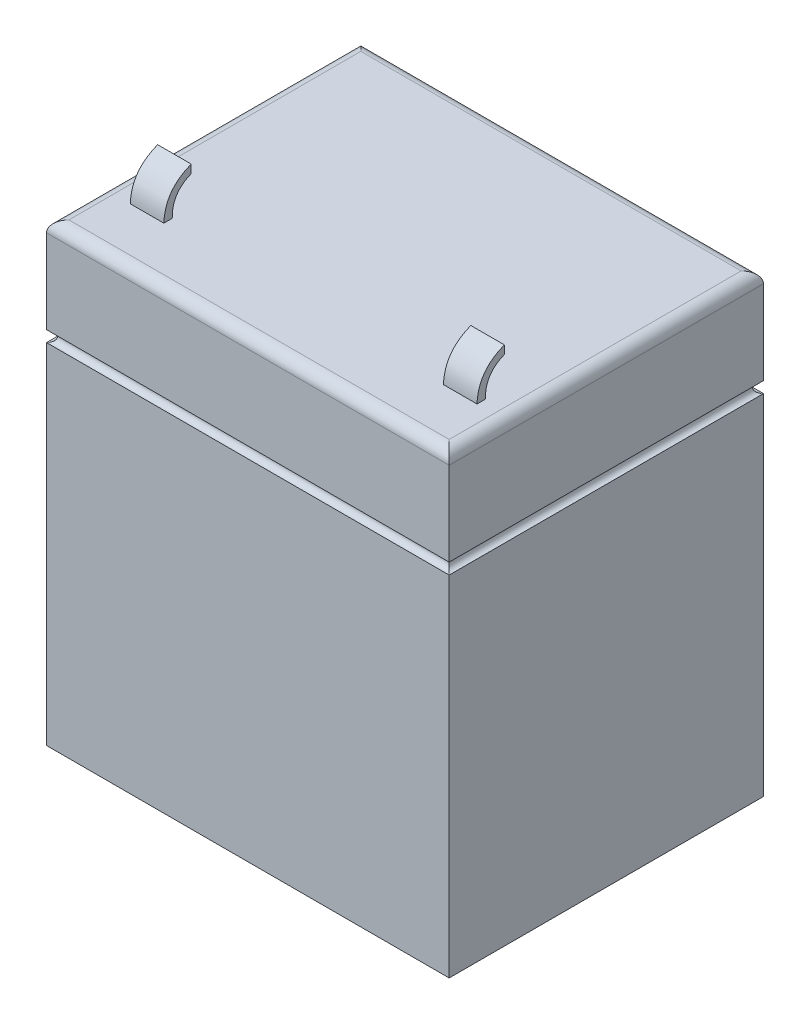
ISO-10303-21;
HEADER;
FILE_DESCRIPTION(('STEP AP214'),'2;1');
FILE_NAME('part.step','',(''),(''),'','','');
FILE_SCHEMA(('AUTOMOTIVE_DESIGN { 1 0 10303 214 1 1 1 1 }'));
ENDSEC;
DATA;
#1=APPLICATION_CONTEXT('core data for automotive mechanical design processes');
#2=APPLICATION_PROTOCOL_DEFINITION('international standard','automotive_design',2000,#1);
#3=PRODUCT_CONTEXT('',#1,'mechanical');
#4=PRODUCT('Part','Part','',(#3));
#5=PRODUCT_RELATED_PRODUCT_CATEGORY('part','',(#4));
#6=PRODUCT_DEFINITION_FORMATION('','',#4);
#7=PRODUCT_DEFINITION_CONTEXT('part definition',#1,'design');
#8=PRODUCT_DEFINITION('design','',#6,#7);
#9=PRODUCT_DEFINITION_SHAPE('','',#8);
#10=(LENGTH_UNIT() NAMED_UNIT(*) SI_UNIT(.MILLI.,.METRE.));
#11=(NAMED_UNIT(*) PLANE_ANGLE_UNIT() SI_UNIT($,.RADIAN.));
#12=(NAMED_UNIT(*) SI_UNIT($,.STERADIAN.) SOLID_ANGLE_UNIT());
#13=UNCERTAINTY_MEASURE_WITH_UNIT(LENGTH_MEASURE(1.E-05),#10,'distance_accuracy_value','');
#14=(GEOMETRIC_REPRESENTATION_CONTEXT(3) GLOBAL_UNCERTAINTY_ASSIGNED_CONTEXT((#13)) GLOBAL_UNIT_ASSIGNED_CONTEXT((#10,
#11,#12)) REPRESENTATION_CONTEXT('',''));
#15=CARTESIAN_POINT('',(0.,0.,0.));
#16=DIRECTION('',(0.,0.,1.));
#17=DIRECTION('',(1.,0.,0.));
#18=AXIS2_PLACEMENT_3D('',#15,#16,#17);
#19=CARTESIAN_POINT('',(0.,103.378,0.));
#20=DIRECTION('',(1.,0.,0.));
#21=DIRECTION('',(0.,0.,-1.));
#22=AXIS2_PLACEMENT_3D('',#19,#20,#21);
#23=PLANE('',#22);
#24=DIRECTION('',(0.,-1.,0.));
#25=VECTOR('',#24,1.);
#26=CARTESIAN_POINT('',(0.,103.378,-71.374));
#27=LINE('',#26,#25);
#28=CARTESIAN_POINT('',(0.,100.838,-71.374));
#29=VERTEX_POINT('',#28);
#30=CARTESIAN_POINT('',(0.,81.788,-71.374));
#31=VERTEX_POINT('',#30);
#32=EDGE_CURVE('E268',#29,#31,#27,.T.);
#33=ORIENTED_EDGE('',*,*,#32,.T.);
#34=DIRECTION('',(0.,0.,1.));
#35=VECTOR('',#34,1.);
#36=CARTESIAN_POINT('',(0.,81.788,-71.374));
#37=LINE('',#36,#35);
#38=CARTESIAN_POINT('',(0.,81.788,0.));
#39=VERTEX_POINT('',#38);
#40=EDGE_CURVE('E274',#31,#39,#37,.T.);
#41=ORIENTED_EDGE('',*,*,#40,.T.);
#42=DIRECTION('',(0.,-1.,0.));
#43=VECTOR('',#42,1.);
#44=CARTESIAN_POINT('',(0.,103.378,0.));
#45=LINE('',#44,#43);
#46=CARTESIAN_POINT('',(0.,100.838,0.));
#47=VERTEX_POINT('',#46);
#48=EDGE_CURVE('E202',#47,#39,#45,.T.);
#49=ORIENTED_EDGE('',*,*,#48,.F.);
#50=DIRECTION('',(0.,0.,1.));
#51=VECTOR('',#50,1.);
#52=CARTESIAN_POINT('',(0.,100.838,0.));
#53=LINE('',#52,#51);
#54=EDGE_CURVE('E244',#47,#29,#53,.F.);
#55=ORIENTED_EDGE('',*,*,#54,.T.);
#56=EDGE_LOOP('',(#33,#41,#49,#55));
#57=FACE_BOUND('',#56,.T.);
#58=ADVANCED_FACE('F35',(#57),#23,.F.);
#59=CARTESIAN_POINT('',(91.44,103.378,0.));
#60=DIRECTION('',(-1.,0.,0.));
#61=DIRECTION('',(0.,0.,1.));
#62=AXIS2_PLACEMENT_3D('',#59,#60,#61);
#63=PLANE('',#62);
#64=DIRECTION('',(0.,-1.,0.));
#65=VECTOR('',#64,1.);
#66=CARTESIAN_POINT('',(91.44,103.378,-71.374));
#67=LINE('',#66,#65);
#68=CARTESIAN_POINT('',(91.44,79.248,-71.374));
#69=VERTEX_POINT('',#68);
#70=CARTESIAN_POINT('',(91.44,0.,-71.374));
#71=VERTEX_POINT('',#70);
#72=EDGE_CURVE('E180',#69,#71,#67,.T.);
#73=ORIENTED_EDGE('',*,*,#72,.F.);
#74=DIRECTION('',(0.,0.,1.));
#75=VECTOR('',#74,1.);
#76=CARTESIAN_POINT('',(91.44,79.248,-71.374));
#77=LINE('',#76,#75);
#78=CARTESIAN_POINT('',(91.44,79.248,0.));
#79=VERTEX_POINT('',#78);
#80=EDGE_CURVE('E164',#69,#79,#77,.T.);
#81=ORIENTED_EDGE('',*,*,#80,.T.);
#82=DIRECTION('',(0.,-1.,0.));
#83=VECTOR('',#82,1.);
#84=CARTESIAN_POINT('',(91.44,103.378,0.));
#85=LINE('',#84,#83);
#86=CARTESIAN_POINT('',(91.44,0.,0.));
#87=VERTEX_POINT('',#86);
#88=EDGE_CURVE('E178',#79,#87,#85,.T.);
#89=ORIENTED_EDGE('',*,*,#88,.T.);
#90=DIRECTION('',(0.,0.,-1.));
#91=VECTOR('',#90,1.);
#92=CARTESIAN_POINT('',(91.44,0.,0.));
#93=LINE('',#92,#91);
#94=EDGE_CURVE('E281',#87,#71,#93,.T.);
#95=ORIENTED_EDGE('',*,*,#94,.T.);
#96=EDGE_LOOP('',(#73,#81,#89,#95));
#97=FACE_BOUND('',#96,.T.);
#98=ADVANCED_FACE('F175',(#97),#63,.F.);
#99=CARTESIAN_POINT('',(0.,103.378,0.));
#100=DIRECTION('',(0.,0.,-1.));
#101=DIRECTION('',(-1.,0.,0.));
#102=AXIS2_PLACEMENT_3D('',#99,#100,#101);
#103=PLANE('',#102);
#104=ORIENTED_EDGE('',*,*,#88,.F.);
#105=DIRECTION('',(-1.,0.,0.));
#106=VECTOR('',#105,1.);
#107=CARTESIAN_POINT('',(91.44,79.248,0.));
#108=LINE('',#107,#106);
#109=CARTESIAN_POINT('',(0.,79.248,0.));
#110=VERTEX_POINT('',#109);
#111=EDGE_CURVE('E184',#79,#110,#108,.T.);
#112=ORIENTED_EDGE('',*,*,#111,.T.);
#113=CARTESIAN_POINT('',(0.,0.,0.));
#114=VERTEX_POINT('',#113);
#115=EDGE_CURVE('E198',#110,#114,#45,.T.);
#116=ORIENTED_EDGE('',*,*,#115,.T.);
#117=DIRECTION('',(1.,0.,0.));
#118=VECTOR('',#117,1.);
#119=CARTESIAN_POINT('',(0.,0.,0.));
#120=LINE('',#119,#118);
#121=EDGE_CURVE('E193',#114,#87,#120,.T.);
#122=ORIENTED_EDGE('',*,*,#121,.T.);
#123=EDGE_LOOP('',(#104,#112,#116,#122));
#124=FACE_BOUND('',#123,.T.);
#125=ADVANCED_FACE('F191',(#124),#103,.F.);
#126=CARTESIAN_POINT('',(0.,103.378,-71.374));
#127=DIRECTION('',(0.,0.,1.));
#128=DIRECTION('',(1.,0.,0.));
#129=AXIS2_PLACEMENT_3D('',#126,#127,#128);
#130=PLANE('',#129);
#131=CARTESIAN_POINT('',(91.44,100.838,-71.374));
#132=VERTEX_POINT('',#131);
#133=CARTESIAN_POINT('',(91.44,81.788,-71.374));
#134=VERTEX_POINT('',#133);
#135=EDGE_CURVE('E196',#132,#134,#67,.T.);
#136=ORIENTED_EDGE('',*,*,#135,.T.);
#137=DIRECTION('',(-1.,0.,0.));
#138=VECTOR('',#137,1.);
#139=CARTESIAN_POINT('',(91.44,81.788,-71.374));
#140=LINE('',#139,#138);
#141=EDGE_CURVE('E172',#134,#31,#140,.T.);
#142=ORIENTED_EDGE('',*,*,#141,.T.);
#143=ORIENTED_EDGE('',*,*,#32,.F.);
#144=DIRECTION('',(-1.,0.,0.));
#145=VECTOR('',#144,1.);
#146=CARTESIAN_POINT('',(0.,100.838,-71.374));
#147=LINE('',#146,#145);
#148=EDGE_CURVE('E50',#29,#132,#147,.F.);
#149=ORIENTED_EDGE('',*,*,#148,.T.);
#150=EDGE_LOOP('',(#136,#142,#143,#149));
#151=FACE_BOUND('',#150,.T.);
#152=ADVANCED_FACE('F267',(#151),#130,.F.);
#153=CARTESIAN_POINT('',(0.,111.903765965489,-18.8821819290486));
#154=CARTESIAN_POINT('',(0.,109.602255934722,-12.9198768256683));
#155=CARTESIAN_POINT('',(0.,103.378,-12.6710321711228));
#156=B_SPLINE_CURVE_WITH_KNOTS('',2,(#153,#154,#155),.UNSPECIFIED.,.F.,.F.,(3,3),(0.,1.),.UNSPECIFIED.);
#157=DIRECTION('',(1.,0.,0.));
#158=VECTOR('',#157,1.);
#159=SURFACE_OF_LINEAR_EXTRUSION('',#156,#158);
#160=CARTESIAN_POINT('',(6.35,111.903765965489,-18.8821819290486));
#161=CARTESIAN_POINT('',(6.35,109.602255934722,-12.9198768256683));
#162=CARTESIAN_POINT('',(6.35,103.378,-12.6710321711228));
#163=B_SPLINE_CURVE_WITH_KNOTS('',2,(#160,#161,#162),.UNSPECIFIED.,.F.,.F.,(3,3),(0.,1.),.UNSPECIFIED.);
#164=CARTESIAN_POINT('',(6.35,103.378,-12.6710321711228));
#165=VERTEX_POINT('',#164);
#166=CARTESIAN_POINT('',(6.35,111.903765965489,-18.8821819290486));
#167=VERTEX_POINT('',#166);
#168=EDGE_CURVE('E292',#165,#167,#163,.F.);
#169=ORIENTED_EDGE('',*,*,#168,.F.);
#170=DIRECTION('',(1.,0.,0.));
#171=VECTOR('',#170,1.);
#172=CARTESIAN_POINT('',(0.,103.378,-12.6710321711228));
#173=LINE('',#172,#171);
#174=CARTESIAN_POINT('',(13.97,103.378,-12.6710321711228));
#175=VERTEX_POINT('',#174);
#176=EDGE_CURVE('E291',#165,#175,#173,.T.);
#177=ORIENTED_EDGE('',*,*,#176,.T.);
#178=CARTESIAN_POINT('',(13.97,111.903765965489,-18.8821819290486));
#179=CARTESIAN_POINT('',(13.97,109.602255934722,-12.9198768256683));
#180=CARTESIAN_POINT('',(13.97,103.378,-12.6710321711228));
#181=B_SPLINE_CURVE_WITH_KNOTS('',2,(#178,#179,#180),.UNSPECIFIED.,.F.,.F.,(3,3),(0.,1.),.UNSPECIFIED.);
#182=CARTESIAN_POINT('',(13.97,111.903765965489,-18.8821819290486));
#183=VERTEX_POINT('',#182);
#184=EDGE_CURVE('E434',#183,#175,#181,.T.);
#185=ORIENTED_EDGE('',*,*,#184,.F.);
#186=DIRECTION('',(1.,0.,0.));
#187=VECTOR('',#186,1.);
#188=CARTESIAN_POINT('',(0.,111.903765965489,-18.8821819290486));
#189=LINE('',#188,#187);
#190=EDGE_CURVE('E287',#167,#183,#189,.T.);
#191=ORIENTED_EDGE('',*,*,#190,.F.);
#192=EDGE_LOOP('',(#169,#177,#185,#191));
#193=FACE_BOUND('',#192,.T.);
#194=ADVANCED_FACE('F330',(#193),#159,.T.);
#195=CARTESIAN_POINT('',(0.,109.998765965489,-18.8821819290486));
#196=DIRECTION('',(0.,0.,-1.));
#197=DIRECTION('',(-1.,0.,0.));
#198=AXIS2_PLACEMENT_3D('',#195,#196,#197);
#199=PLANE('',#198);
#200=DIRECTION('',(0.,-1.,0.));
#201=VECTOR('',#200,1.);
#202=CARTESIAN_POINT('',(6.35,109.998765965489,-18.8821819290486));
#203=LINE('',#202,#201);
#204=CARTESIAN_POINT('',(6.35,109.998765965489,-18.8821819290486));
#205=VERTEX_POINT('',#204);
#206=EDGE_CURVE('E397',#167,#205,#203,.T.);
#207=ORIENTED_EDGE('',*,*,#206,.F.);
#208=ORIENTED_EDGE('',*,*,#190,.T.);
#209=DIRECTION('',(0.,1.,0.));
#210=VECTOR('',#209,1.);
#211=CARTESIAN_POINT('',(13.97,109.998765965489,-18.8821819290486));
#212=LINE('',#211,#210);
#213=CARTESIAN_POINT('',(13.97,109.998765965489,-18.8821819290486));
#214=VERTEX_POINT('',#213);
#215=EDGE_CURVE('E429',#214,#183,#212,.T.);
#216=ORIENTED_EDGE('',*,*,#215,.F.);
#217=DIRECTION('',(1.,0.,0.));
#218=VECTOR('',#217,1.);
#219=CARTESIAN_POINT('',(0.,109.998765965489,-18.8821819290486));
#220=LINE('',#219,#218);
#221=EDGE_CURVE('E300',#205,#214,#220,.T.);
#222=ORIENTED_EDGE('',*,*,#221,.F.);
#223=EDGE_LOOP('',(#207,#208,#216,#222));
#224=FACE_BOUND('',#223,.T.);
#225=ADVANCED_FACE('F383',(#224),#199,.T.);
#226=CARTESIAN_POINT('',(0.,103.378,-14.5760321711228));
#227=CARTESIAN_POINT('',(0.,108.255817866048,-14.4616285672866));
#228=CARTESIAN_POINT('',(0.,109.998765965489,-18.8821819290486));
#229=B_SPLINE_CURVE_WITH_KNOTS('',2,(#226,#227,#228),.UNSPECIFIED.,.F.,.F.,(3,3),(0.,1.),.UNSPECIFIED.);
#230=DIRECTION('',(1.,0.,0.));
#231=VECTOR('',#230,1.);
#232=SURFACE_OF_LINEAR_EXTRUSION('',#229,#231);
#233=CARTESIAN_POINT('',(6.35,103.378,-14.5760321711228));
#234=CARTESIAN_POINT('',(6.35,108.255817866048,-14.4616285672866));
#235=CARTESIAN_POINT('',(6.35,109.998765965489,-18.8821819290486));
#236=B_SPLINE_CURVE_WITH_KNOTS('',2,(#233,#234,#235),.UNSPECIFIED.,.F.,.F.,(3,3),(0.,1.),.UNSPECIFIED.);
#237=CARTESIAN_POINT('',(6.35,103.378,-14.5760321711228));
#238=VERTEX_POINT('',#237);
#239=EDGE_CURVE('E224',#205,#238,#236,.F.);
#240=ORIENTED_EDGE('',*,*,#239,.F.);
#241=ORIENTED_EDGE('',*,*,#221,.T.);
#242=CARTESIAN_POINT('',(13.97,103.378,-14.5760321711228));
#243=CARTESIAN_POINT('',(13.97,108.255817866048,-14.4616285672866));
#244=CARTESIAN_POINT('',(13.97,109.998765965489,-18.8821819290486));
#245=B_SPLINE_CURVE_WITH_KNOTS('',2,(#242,#243,#244),.UNSPECIFIED.,.F.,.F.,(3,3),(0.,1.),.UNSPECIFIED.);
#246=CARTESIAN_POINT('',(13.97,103.378,-14.5760321711228));
#247=VERTEX_POINT('',#246);
#248=EDGE_CURVE('E217',#247,#214,#245,.T.);
#249=ORIENTED_EDGE('',*,*,#248,.F.);
#250=DIRECTION('',(1.,0.,0.));
#251=VECTOR('',#250,1.);
#252=CARTESIAN_POINT('',(0.,103.378,-14.5760321711228));
#253=LINE('',#252,#251);
#254=EDGE_CURVE('E296',#238,#247,#253,.T.);
#255=ORIENTED_EDGE('',*,*,#254,.F.);
#256=EDGE_LOOP('',(#240,#241,#249,#255));
#257=FACE_BOUND('',#256,.T.);
#258=ADVANCED_FACE('F323',(#257),#232,.T.);
#259=ORIENTED_EDGE('',*,*,#115,.F.);
#260=DIRECTION('',(0.,0.,1.));
#261=VECTOR('',#260,1.);
#262=CARTESIAN_POINT('',(0.,79.248,-71.374));
#263=LINE('',#262,#261);
#264=CARTESIAN_POINT('',(0.,79.248,-71.374));
#265=VERTEX_POINT('',#264);
#266=EDGE_CURVE('E477',#110,#265,#263,.F.);
#267=ORIENTED_EDGE('',*,*,#266,.T.);
#268=CARTESIAN_POINT('',(0.,0.,-71.374));
#269=VERTEX_POINT('',#268);
#270=EDGE_CURVE('E276',#265,#269,#27,.T.);
#271=ORIENTED_EDGE('',*,*,#270,.T.);
#272=DIRECTION('',(0.,0.,1.));
#273=VECTOR('',#272,1.);
#274=CARTESIAN_POINT('',(0.,0.,0.));
#275=LINE('',#274,#273);
#276=EDGE_CURVE('E284',#269,#114,#275,.T.);
#277=ORIENTED_EDGE('',*,*,#276,.T.);
#278=EDGE_LOOP('',(#259,#267,#271,#277));
#279=FACE_BOUND('',#278,.T.);
#280=ADVANCED_FACE('F348',(#279),#23,.F.);
#281=ORIENTED_EDGE('',*,*,#48,.T.);
#282=DIRECTION('',(-1.,0.,0.));
#283=VECTOR('',#282,1.);
#284=CARTESIAN_POINT('',(91.44,81.788,0.));
#285=LINE('',#284,#283);
#286=CARTESIAN_POINT('',(91.44,81.788,0.));
#287=VERTEX_POINT('',#286);
#288=EDGE_CURVE('E189',#39,#287,#285,.F.);
#289=ORIENTED_EDGE('',*,*,#288,.T.);
#290=CARTESIAN_POINT('',(91.44,100.838,0.));
#291=VERTEX_POINT('',#290);
#292=EDGE_CURVE('E195',#291,#287,#85,.T.);
#293=ORIENTED_EDGE('',*,*,#292,.F.);
#294=DIRECTION('',(1.,0.,0.));
#295=VECTOR('',#294,1.);
#296=CARTESIAN_POINT('',(0.,100.838,0.));
#297=LINE('',#296,#295);
#298=EDGE_CURVE('E247',#291,#47,#297,.F.);
#299=ORIENTED_EDGE('',*,*,#298,.T.);
#300=EDGE_LOOP('',(#281,#289,#293,#299));
#301=FACE_BOUND('',#300,.T.);
#302=ADVANCED_FACE('F345',(#301),#103,.F.);
#303=ORIENTED_EDGE('',*,*,#292,.T.);
#304=DIRECTION('',(0.,0.,1.));
#305=VECTOR('',#304,1.);
#306=CARTESIAN_POINT('',(91.44,81.788,-71.374));
#307=LINE('',#306,#305);
#308=EDGE_CURVE('E167',#287,#134,#307,.F.);
#309=ORIENTED_EDGE('',*,*,#308,.T.);
#310=ORIENTED_EDGE('',*,*,#135,.F.);
#311=DIRECTION('',(0.,0.,-1.));
#312=VECTOR('',#311,1.);
#313=CARTESIAN_POINT('',(91.44,100.838,0.));
#314=LINE('',#313,#312);
#315=EDGE_CURVE('E57',#132,#291,#314,.F.);
#316=ORIENTED_EDGE('',*,*,#315,.T.);
#317=EDGE_LOOP('',(#303,#309,#310,#316));
#318=FACE_BOUND('',#317,.T.);
#319=ADVANCED_FACE('F341',(#318),#63,.F.);
#320=ORIENTED_EDGE('',*,*,#270,.F.);
#321=DIRECTION('',(-1.,0.,0.));
#322=VECTOR('',#321,1.);
#323=CARTESIAN_POINT('',(91.44,79.248,-71.374));
#324=LINE('',#323,#322);
#325=EDGE_CURVE('E251',#265,#69,#324,.F.);
#326=ORIENTED_EDGE('',*,*,#325,.T.);
#327=ORIENTED_EDGE('',*,*,#72,.T.);
#328=DIRECTION('',(-1.,0.,0.));
#329=VECTOR('',#328,1.);
#330=CARTESIAN_POINT('',(0.,0.,-71.374));
#331=LINE('',#330,#329);
#332=EDGE_CURVE('E277',#71,#269,#331,.T.);
#333=ORIENTED_EDGE('',*,*,#332,.T.);
#334=EDGE_LOOP('',(#320,#326,#327,#333));
#335=FACE_BOUND('',#334,.T.);
#336=ADVANCED_FACE('F334',(#335),#130,.F.);
#337=CARTESIAN_POINT('',(0.,103.378,0.));
#338=DIRECTION('',(0.,-1.,0.));
#339=DIRECTION('',(0.,0.,-1.));
#340=AXIS2_PLACEMENT_3D('',#337,#338,#339);
#341=PLANE('',#340);
#342=DIRECTION('',(-1.,0.,0.));
#343=VECTOR('',#342,1.);
#344=CARTESIAN_POINT('',(0.,103.378,-68.834));
#345=LINE('',#344,#343);
#346=CARTESIAN_POINT('',(88.9,103.378,-68.834));
#347=VERTEX_POINT('',#346);
#348=CARTESIAN_POINT('',(2.54,103.378,-68.834));
#349=VERTEX_POINT('',#348);
#350=EDGE_CURVE('E237',#347,#349,#345,.T.);
#351=ORIENTED_EDGE('',*,*,#350,.T.);
#352=DIRECTION('',(0.,0.,1.));
#353=VECTOR('',#352,1.);
#354=CARTESIAN_POINT('',(2.54,103.378,0.));
#355=LINE('',#354,#353);
#356=CARTESIAN_POINT('',(2.54,103.378,-2.54));
#357=VERTEX_POINT('',#356);
#358=EDGE_CURVE('E241',#349,#357,#355,.T.);
#359=ORIENTED_EDGE('',*,*,#358,.T.);
#360=DIRECTION('',(1.,0.,0.));
#361=VECTOR('',#360,1.);
#362=CARTESIAN_POINT('',(0.,103.378,-2.54));
#363=LINE('',#362,#361);
#364=CARTESIAN_POINT('',(88.9,103.378,-2.54));
#365=VERTEX_POINT('',#364);
#366=EDGE_CURVE('E239',#357,#365,#363,.T.);
#367=ORIENTED_EDGE('',*,*,#366,.T.);
#368=DIRECTION('',(0.,0.,-1.));
#369=VECTOR('',#368,1.);
#370=CARTESIAN_POINT('',(88.9,103.378,0.));
#371=LINE('',#370,#369);
#372=EDGE_CURVE('E232',#365,#347,#371,.T.);
#373=ORIENTED_EDGE('',*,*,#372,.T.);
#374=EDGE_LOOP('',(#351,#359,#367,#373));
#375=FACE_BOUND('',#374,.T.);
#376=ORIENTED_EDGE('',*,*,#176,.F.);
#377=DIRECTION('',(0.,0.,1.));
#378=VECTOR('',#377,1.);
#379=CARTESIAN_POINT('',(6.35,103.378,-71.374));
#380=LINE('',#379,#378);
#381=EDGE_CURVE('E402',#238,#165,#380,.T.);
#382=ORIENTED_EDGE('',*,*,#381,.F.);
#383=ORIENTED_EDGE('',*,*,#254,.T.);
#384=DIRECTION('',(0.,0.,1.));
#385=VECTOR('',#384,1.);
#386=CARTESIAN_POINT('',(13.97,103.378,-71.374));
#387=LINE('',#386,#385);
#388=EDGE_CURVE('E403',#247,#175,#387,.T.);
#389=ORIENTED_EDGE('',*,*,#388,.T.);
#390=EDGE_LOOP('',(#376,#382,#383,#389));
#391=FACE_BOUND('',#390,.T.);
#392=CARTESIAN_POINT('',(77.47,103.378,-12.6710321711228));
#393=VERTEX_POINT('',#392);
#394=CARTESIAN_POINT('',(85.09,103.378,-12.6710321711228));
#395=VERTEX_POINT('',#394);
#396=EDGE_CURVE('E288',#393,#395,#173,.T.);
#397=ORIENTED_EDGE('',*,*,#396,.F.);
#398=DIRECTION('',(0.,0.,1.));
#399=VECTOR('',#398,1.);
#400=CARTESIAN_POINT('',(77.47,103.378,-71.374));
#401=LINE('',#400,#399);
#402=CARTESIAN_POINT('',(77.47,103.378,-14.5760321711228));
#403=VERTEX_POINT('',#402);
#404=EDGE_CURVE('E407',#403,#393,#401,.T.);
#405=ORIENTED_EDGE('',*,*,#404,.F.);
#406=CARTESIAN_POINT('',(85.09,103.378,-14.5760321711228));
#407=VERTEX_POINT('',#406);
#408=EDGE_CURVE('E293',#403,#407,#253,.T.);
#409=ORIENTED_EDGE('',*,*,#408,.T.);
#410=DIRECTION('',(0.,0.,1.));
#411=VECTOR('',#410,1.);
#412=CARTESIAN_POINT('',(85.09,103.378,-71.374));
#413=LINE('',#412,#411);
#414=EDGE_CURVE('E261',#407,#395,#413,.T.);
#415=ORIENTED_EDGE('',*,*,#414,.T.);
#416=EDGE_LOOP('',(#397,#405,#409,#415));
#417=FACE_BOUND('',#416,.T.);
#418=ADVANCED_FACE('F331',(#375,#391,#417),#341,.F.);
#419=CARTESIAN_POINT('',(0.,0.,0.));
#420=DIRECTION('',(0.,-1.,0.));
#421=DIRECTION('',(0.,0.,-1.));
#422=AXIS2_PLACEMENT_3D('',#419,#420,#421);
#423=PLANE('',#422);
#424=ORIENTED_EDGE('',*,*,#276,.F.);
#425=ORIENTED_EDGE('',*,*,#332,.F.);
#426=ORIENTED_EDGE('',*,*,#94,.F.);
#427=ORIENTED_EDGE('',*,*,#121,.F.);
#428=EDGE_LOOP('',(#424,#425,#426,#427));
#429=FACE_BOUND('',#428,.T.);
#430=ADVANCED_FACE('F328',(#429),#423,.T.);
#431=CARTESIAN_POINT('',(77.47,111.903765965489,-18.8821819290486));
#432=CARTESIAN_POINT('',(77.47,109.602255934722,-12.9198768256683));
#433=CARTESIAN_POINT('',(77.47,103.378,-12.6710321711228));
#434=B_SPLINE_CURVE_WITH_KNOTS('',2,(#431,#432,#433),.UNSPECIFIED.,.F.,.F.,(3,3),(0.,1.),.UNSPECIFIED.);
#435=CARTESIAN_POINT('',(77.47,111.903765965489,-18.8821819290486));
#436=VERTEX_POINT('',#435);
#437=EDGE_CURVE('E425',#393,#436,#434,.F.);
#438=ORIENTED_EDGE('',*,*,#437,.F.);
#439=ORIENTED_EDGE('',*,*,#396,.T.);
#440=CARTESIAN_POINT('',(85.09,111.903765965489,-18.8821819290486));
#441=CARTESIAN_POINT('',(85.09,109.602255934722,-12.9198768256683));
#442=CARTESIAN_POINT('',(85.09,103.378,-12.6710321711228));
#443=B_SPLINE_CURVE_WITH_KNOTS('',2,(#440,#441,#442),.UNSPECIFIED.,.F.,.F.,(3,3),(0.,1.),.UNSPECIFIED.);
#444=CARTESIAN_POINT('',(85.09,111.903765965489,-18.8821819290486));
#445=VERTEX_POINT('',#444);
#446=EDGE_CURVE('E416',#445,#395,#443,.T.);
#447=ORIENTED_EDGE('',*,*,#446,.F.);
#448=EDGE_CURVE('E301',#436,#445,#189,.T.);
#449=ORIENTED_EDGE('',*,*,#448,.F.);
#450=EDGE_LOOP('',(#438,#439,#447,#449));
#451=FACE_BOUND('',#450,.T.);
#452=ADVANCED_FACE('F325',(#451),#159,.T.);
#453=DIRECTION('',(0.,-1.,0.));
#454=VECTOR('',#453,1.);
#455=CARTESIAN_POINT('',(77.47,109.998765965489,-18.8821819290486));
#456=LINE('',#455,#454);
#457=CARTESIAN_POINT('',(77.47,109.998765965489,-18.8821819290486));
#458=VERTEX_POINT('',#457);
#459=EDGE_CURVE('E420',#436,#458,#456,.T.);
#460=ORIENTED_EDGE('',*,*,#459,.F.);
#461=ORIENTED_EDGE('',*,*,#448,.T.);
#462=DIRECTION('',(0.,1.,0.));
#463=VECTOR('',#462,1.);
#464=CARTESIAN_POINT('',(85.09,109.998765965489,-18.8821819290486));
#465=LINE('',#464,#463);
#466=CARTESIAN_POINT('',(85.09,109.998765965489,-18.8821819290486));
#467=VERTEX_POINT('',#466);
#468=EDGE_CURVE('E414',#467,#445,#465,.T.);
#469=ORIENTED_EDGE('',*,*,#468,.F.);
#470=EDGE_CURVE('E297',#458,#467,#220,.T.);
#471=ORIENTED_EDGE('',*,*,#470,.F.);
#472=EDGE_LOOP('',(#460,#461,#469,#471));
#473=FACE_BOUND('',#472,.T.);
#474=ADVANCED_FACE('F321',(#473),#199,.T.);
#475=CARTESIAN_POINT('',(77.47,103.378,-14.5760321711228));
#476=CARTESIAN_POINT('',(77.47,108.255817866048,-14.4616285672866));
#477=CARTESIAN_POINT('',(77.47,109.998765965489,-18.8821819290486));
#478=B_SPLINE_CURVE_WITH_KNOTS('',2,(#475,#476,#477),.UNSPECIFIED.,.F.,.F.,(3,3),(0.,1.),.UNSPECIFIED.);
#479=EDGE_CURVE('E209',#458,#403,#478,.F.);
#480=ORIENTED_EDGE('',*,*,#479,.F.);
#481=ORIENTED_EDGE('',*,*,#470,.T.);
#482=CARTESIAN_POINT('',(85.09,103.378,-14.5760321711228));
#483=CARTESIAN_POINT('',(85.09,108.255817866048,-14.4616285672866));
#484=CARTESIAN_POINT('',(85.09,109.998765965489,-18.8821819290486));
#485=B_SPLINE_CURVE_WITH_KNOTS('',2,(#482,#483,#484),.UNSPECIFIED.,.F.,.F.,(3,3),(0.,1.),.UNSPECIFIED.);
#486=EDGE_CURVE('E205',#407,#467,#485,.T.);
#487=ORIENTED_EDGE('',*,*,#486,.F.);
#488=ORIENTED_EDGE('',*,*,#408,.F.);
#489=EDGE_LOOP('',(#480,#481,#487,#488));
#490=FACE_BOUND('',#489,.T.);
#491=ADVANCED_FACE('F316',(#490),#232,.T.);
#492=CARTESIAN_POINT('',(85.09,103.378,-71.374));
#493=DIRECTION('',(-1.,0.,0.));
#494=DIRECTION('',(0.,0.,1.));
#495=AXIS2_PLACEMENT_3D('',#492,#493,#494);
#496=PLANE('',#495);
#497=ORIENTED_EDGE('',*,*,#446,.T.);
#498=ORIENTED_EDGE('',*,*,#414,.F.);
#499=ORIENTED_EDGE('',*,*,#486,.T.);
#500=ORIENTED_EDGE('',*,*,#468,.T.);
#501=EDGE_LOOP('',(#497,#498,#499,#500));
#502=FACE_BOUND('',#501,.T.);
#503=ADVANCED_FACE('F320',(#502),#496,.F.);
#504=CARTESIAN_POINT('',(13.97,103.378,-71.374));
#505=DIRECTION('',(-1.,0.,0.));
#506=DIRECTION('',(0.,0.,1.));
#507=AXIS2_PLACEMENT_3D('',#504,#505,#506);
#508=PLANE('',#507);
#509=ORIENTED_EDGE('',*,*,#184,.T.);
#510=ORIENTED_EDGE('',*,*,#388,.F.);
#511=ORIENTED_EDGE('',*,*,#248,.T.);
#512=ORIENTED_EDGE('',*,*,#215,.T.);
#513=EDGE_LOOP('',(#509,#510,#511,#512));
#514=FACE_BOUND('',#513,.T.);
#515=ADVANCED_FACE('F451',(#514),#508,.F.);
#516=CARTESIAN_POINT('',(77.47,103.378,-71.374));
#517=DIRECTION('',(1.,0.,0.));
#518=DIRECTION('',(0.,0.,-1.));
#519=AXIS2_PLACEMENT_3D('',#516,#517,#518);
#520=PLANE('',#519);
#521=ORIENTED_EDGE('',*,*,#437,.T.);
#522=ORIENTED_EDGE('',*,*,#459,.T.);
#523=ORIENTED_EDGE('',*,*,#479,.T.);
#524=ORIENTED_EDGE('',*,*,#404,.T.);
#525=EDGE_LOOP('',(#521,#522,#523,#524));
#526=FACE_BOUND('',#525,.T.);
#527=ADVANCED_FACE('F453',(#526),#520,.F.);
#528=CARTESIAN_POINT('',(6.35,103.378,-71.374));
#529=DIRECTION('',(1.,0.,0.));
#530=DIRECTION('',(0.,0.,-1.));
#531=AXIS2_PLACEMENT_3D('',#528,#529,#530);
#532=PLANE('',#531);
#533=ORIENTED_EDGE('',*,*,#168,.T.);
#534=ORIENTED_EDGE('',*,*,#206,.T.);
#535=ORIENTED_EDGE('',*,*,#239,.T.);
#536=ORIENTED_EDGE('',*,*,#381,.T.);
#537=EDGE_LOOP('',(#533,#534,#535,#536));
#538=FACE_BOUND('',#537,.T.);
#539=ADVANCED_FACE('F367',(#538),#532,.F.);
#540=CARTESIAN_POINT('',(88.9,100.838,0.));
#541=DIRECTION('',(0.,0.,-1.));
#542=DIRECTION('',(-1.,0.,0.));
#543=AXIS2_PLACEMENT_3D('',#540,#541,#542);
#544=CYLINDRICAL_SURFACE('',#543,2.54);
#545=CARTESIAN_POINT('',(88.9,100.838,-2.54));
#546=DIRECTION('',(0.707106781186547,0.,-0.707106781186547));
#547=DIRECTION('',(-0.707106781186547,0.,-0.707106781186547));
#548=AXIS2_PLACEMENT_3D('',#545,#546,#547);
#549=ELLIPSE('',#548,3.59210244842766,2.54);
#550=EDGE_CURVE('E255',#291,#365,#549,.F.);
#551=ORIENTED_EDGE('',*,*,#550,.F.);
#552=ORIENTED_EDGE('',*,*,#315,.F.);
#553=CARTESIAN_POINT('',(88.9,100.838,-68.834));
#554=DIRECTION('',(-0.707106781186547,0.,-0.707106781186547));
#555=DIRECTION('',(0.707106781186547,0.,-0.707106781186547));
#556=AXIS2_PLACEMENT_3D('',#553,#554,#555);
#557=ELLIPSE('',#556,3.59210244842766,2.54);
#558=EDGE_CURVE('E258',#347,#132,#557,.T.);
#559=ORIENTED_EDGE('',*,*,#558,.F.);
#560=ORIENTED_EDGE('',*,*,#372,.F.);
#561=EDGE_LOOP('',(#551,#552,#559,#560));
#562=FACE_BOUND('',#561,.T.);
#563=ADVANCED_FACE('F37',(#562),#544,.T.);
#564=CARTESIAN_POINT('',(0.,100.838,-68.834));
#565=DIRECTION('',(-1.,0.,0.));
#566=DIRECTION('',(0.,0.,1.));
#567=AXIS2_PLACEMENT_3D('',#564,#565,#566);
#568=CYLINDRICAL_SURFACE('',#567,2.54);
#569=ORIENTED_EDGE('',*,*,#558,.T.);
#570=ORIENTED_EDGE('',*,*,#148,.F.);
#571=CARTESIAN_POINT('',(2.54,100.838,-68.834));
#572=DIRECTION('',(-0.707106781186547,0.,0.707106781186547));
#573=DIRECTION('',(-0.707106781186547,0.,-0.707106781186547));
#574=AXIS2_PLACEMENT_3D('',#571,#572,#573);
#575=ELLIPSE('',#574,3.59210244842766,2.54);
#576=EDGE_CURVE('E253',#349,#29,#575,.T.);
#577=ORIENTED_EDGE('',*,*,#576,.F.);
#578=ORIENTED_EDGE('',*,*,#350,.F.);
#579=EDGE_LOOP('',(#569,#570,#577,#578));
#580=FACE_BOUND('',#579,.T.);
#581=ADVANCED_FACE('F360',(#580),#568,.T.);
#582=CARTESIAN_POINT('',(0.,100.838,-2.54));
#583=DIRECTION('',(1.,0.,0.));
#584=DIRECTION('',(0.,0.,-1.));
#585=AXIS2_PLACEMENT_3D('',#582,#583,#584);
#586=CYLINDRICAL_SURFACE('',#585,2.54);
#587=ORIENTED_EDGE('',*,*,#550,.T.);
#588=ORIENTED_EDGE('',*,*,#366,.F.);
#589=CARTESIAN_POINT('',(2.54,100.838,-2.54));
#590=DIRECTION('',(0.707106781186547,0.,0.707106781186547));
#591=DIRECTION('',(0.707106781186547,0.,-0.707106781186547));
#592=AXIS2_PLACEMENT_3D('',#589,#590,#591);
#593=ELLIPSE('',#592,3.59210244842766,2.54);
#594=EDGE_CURVE('E188',#47,#357,#593,.F.);
#595=ORIENTED_EDGE('',*,*,#594,.F.);
#596=ORIENTED_EDGE('',*,*,#298,.F.);
#597=EDGE_LOOP('',(#587,#588,#595,#596));
#598=FACE_BOUND('',#597,.T.);
#599=ADVANCED_FACE('F357',(#598),#586,.T.);
#600=CARTESIAN_POINT('',(2.54,100.838,0.));
#601=DIRECTION('',(0.,0.,1.));
#602=DIRECTION('',(1.,0.,0.));
#603=AXIS2_PLACEMENT_3D('',#600,#601,#602);
#604=CYLINDRICAL_SURFACE('',#603,2.54);
#605=ORIENTED_EDGE('',*,*,#576,.T.);
#606=ORIENTED_EDGE('',*,*,#54,.F.);
#607=ORIENTED_EDGE('',*,*,#594,.T.);
#608=ORIENTED_EDGE('',*,*,#358,.F.);
#609=EDGE_LOOP('',(#605,#606,#607,#608));
#610=FACE_BOUND('',#609,.T.);
#611=ADVANCED_FACE('F353',(#610),#604,.T.);
#612=CARTESIAN_POINT('',(91.44,80.518,-71.374));
#613=DIRECTION('',(-1.,0.,0.));
#614=DIRECTION('',(0.,0.,1.));
#615=AXIS2_PLACEMENT_3D('',#612,#613,#614);
#616=CYLINDRICAL_SURFACE('',#615,1.26999999999999);
#617=ORIENTED_EDGE('',*,*,#325,.F.);
#618=CARTESIAN_POINT('',(0.,80.518,-71.374));
#619=DIRECTION('',(-0.707106781186547,0.,0.707106781186547));
#620=DIRECTION('',(-0.707106781186547,0.,-0.707106781186547));
#621=AXIS2_PLACEMENT_3D('',#618,#619,#620);
#622=ELLIPSE('',#621,1.79605122421382,1.26999999999999);
#623=EDGE_CURVE('E478',#265,#31,#622,.T.);
#624=ORIENTED_EDGE('',*,*,#623,.T.);
#625=ORIENTED_EDGE('',*,*,#141,.F.);
#626=CARTESIAN_POINT('',(91.44,80.518,-71.374));
#627=DIRECTION('',(-0.707106781186547,0.,-0.707106781186547));
#628=DIRECTION('',(-0.707106781186547,0.,0.707106781186547));
#629=AXIS2_PLACEMENT_3D('',#626,#627,#628);
#630=ELLIPSE('',#629,1.79605122421382,1.26999999999999);
#631=EDGE_CURVE('E181',#134,#69,#630,.F.);
#632=ORIENTED_EDGE('',*,*,#631,.T.);
#633=EDGE_LOOP('',(#617,#624,#625,#632));
#634=FACE_BOUND('',#633,.T.);
#635=ADVANCED_FACE('F356',(#634),#616,.F.);
#636=CARTESIAN_POINT('',(91.44,80.518,0.));
#637=DIRECTION('',(-1.,0.,0.));
#638=DIRECTION('',(0.,0.,1.));
#639=AXIS2_PLACEMENT_3D('',#636,#637,#638);
#640=CYLINDRICAL_SURFACE('',#639,1.27);
#641=ORIENTED_EDGE('',*,*,#288,.F.);
#642=CARTESIAN_POINT('',(0.,80.518,0.));
#643=DIRECTION('',(-0.707106781186547,0.,-0.707106781186547));
#644=DIRECTION('',(-0.707106781186547,0.,0.707106781186547));
#645=AXIS2_PLACEMENT_3D('',#642,#643,#644);
#646=ELLIPSE('',#645,1.79605122421383,1.27);
#647=EDGE_CURVE('E11',#39,#110,#646,.T.);
#648=ORIENTED_EDGE('',*,*,#647,.T.);
#649=ORIENTED_EDGE('',*,*,#111,.F.);
#650=CARTESIAN_POINT('',(91.44,80.518,0.));
#651=DIRECTION('',(-0.707106781186547,0.,0.707106781186547));
#652=DIRECTION('',(-0.707106781186547,0.,-0.707106781186547));
#653=AXIS2_PLACEMENT_3D('',#650,#651,#652);
#654=ELLIPSE('',#653,1.79605122421382,1.27);
#655=EDGE_CURVE('E43',#79,#287,#654,.F.);
#656=ORIENTED_EDGE('',*,*,#655,.T.);
#657=EDGE_LOOP('',(#641,#648,#649,#656));
#658=FACE_BOUND('',#657,.T.);
#659=ADVANCED_FACE('F185',(#658),#640,.F.);
#660=CARTESIAN_POINT('',(91.44,80.518,-71.374));
#661=DIRECTION('',(0.,0.,1.));
#662=DIRECTION('',(1.,0.,0.));
#663=AXIS2_PLACEMENT_3D('',#660,#661,#662);
#664=CYLINDRICAL_SURFACE('',#663,1.26999999999999);
#665=ORIENTED_EDGE('',*,*,#308,.F.);
#666=ORIENTED_EDGE('',*,*,#655,.F.);
#667=ORIENTED_EDGE('',*,*,#80,.F.);
#668=ORIENTED_EDGE('',*,*,#631,.F.);
#669=EDGE_LOOP('',(#665,#666,#667,#668));
#670=FACE_BOUND('',#669,.T.);
#671=ADVANCED_FACE('F163',(#670),#664,.F.);
#672=CARTESIAN_POINT('',(0.,80.518,-71.374));
#673=DIRECTION('',(0.,0.,1.));
#674=DIRECTION('',(1.,0.,0.));
#675=AXIS2_PLACEMENT_3D('',#672,#673,#674);
#676=CYLINDRICAL_SURFACE('',#675,1.27);
#677=ORIENTED_EDGE('',*,*,#266,.F.);
#678=ORIENTED_EDGE('',*,*,#647,.F.);
#679=ORIENTED_EDGE('',*,*,#40,.F.);
#680=ORIENTED_EDGE('',*,*,#623,.F.);
#681=EDGE_LOOP('',(#677,#678,#679,#680));
#682=FACE_BOUND('',#681,.T.);
#683=ADVANCED_FACE('F471',(#682),#676,.F.);
#684=CLOSED_SHELL('',(#58,#98,#125,#152,#194,#225,#258,#280,#302,#319,#336,#418,#430,#452,#474,
#491,#503,#515,#527,#539,#563,#581,#599,#611,#635,#659,#671,#683));
#685=MANIFOLD_SOLID_BREP('B2',#684);
#686=ADVANCED_BREP_SHAPE_REPRESENTATION('',(#18,#685),#14);
#687=SHAPE_DEFINITION_REPRESENTATION(#9,#686);
ENDSEC;
END-ISO-10303-21;
